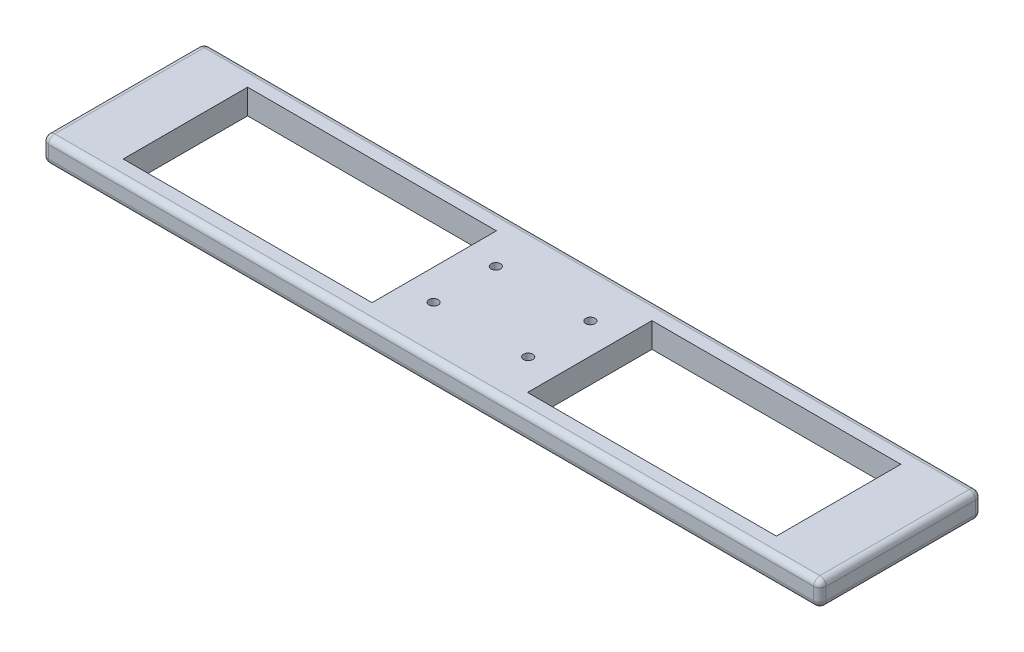
ISO-10303-21;
HEADER;
FILE_DESCRIPTION(('STEP AP214'),'2;1');
FILE_NAME('part.step','',(''),(''),'','','');
FILE_SCHEMA(('AUTOMOTIVE_DESIGN { 1 0 10303 214 1 1 1 1 }'));
ENDSEC;
DATA;
#1=APPLICATION_CONTEXT('core data for automotive mechanical design processes');
#2=APPLICATION_PROTOCOL_DEFINITION('international standard','automotive_design',2000,#1);
#3=PRODUCT_CONTEXT('',#1,'mechanical');
#4=PRODUCT('Part','Part','',(#3));
#5=PRODUCT_RELATED_PRODUCT_CATEGORY('part','',(#4));
#6=PRODUCT_DEFINITION_FORMATION('','',#4);
#7=PRODUCT_DEFINITION_CONTEXT('part definition',#1,'design');
#8=PRODUCT_DEFINITION('design','',#6,#7);
#9=PRODUCT_DEFINITION_SHAPE('','',#8);
#10=(LENGTH_UNIT() NAMED_UNIT(*) SI_UNIT(.MILLI.,.METRE.));
#11=(NAMED_UNIT(*) PLANE_ANGLE_UNIT() SI_UNIT($,.RADIAN.));
#12=(NAMED_UNIT(*) SI_UNIT($,.STERADIAN.) SOLID_ANGLE_UNIT());
#13=UNCERTAINTY_MEASURE_WITH_UNIT(LENGTH_MEASURE(1.E-05),#10,'distance_accuracy_value','');
#14=(GEOMETRIC_REPRESENTATION_CONTEXT(3) GLOBAL_UNCERTAINTY_ASSIGNED_CONTEXT((#13)) GLOBAL_UNIT_ASSIGNED_CONTEXT((#10,
#11,#12)) REPRESENTATION_CONTEXT('',''));
#15=CARTESIAN_POINT('',(0.,0.,0.));
#16=DIRECTION('',(0.,0.,1.));
#17=DIRECTION('',(1.,0.,0.));
#18=AXIS2_PLACEMENT_3D('',#15,#16,#17);
#19=CARTESIAN_POINT('',(0.,4.,0.));
#20=DIRECTION('',(0.,-1.,0.));
#21=DIRECTION('',(0.,0.,-1.));
#22=AXIS2_PLACEMENT_3D('',#19,#20,#21);
#23=PLANE('',#22);
#24=CARTESIAN_POINT('',(54.9,4.,-18.));
#25=DIRECTION('',(0.,1.,0.));
#26=DIRECTION('',(0.,0.,1.));
#27=AXIS2_PLACEMENT_3D('',#24,#25,#26);
#28=CIRCLE('',#27,0.749999999999987);
#29=CARTESIAN_POINT('',(54.9,4.,-17.25));
#30=VERTEX_POINT('',#29);
#31=EDGE_CURVE('E467',#30,#30,#28,.T.);
#32=ORIENTED_EDGE('',*,*,#31,.F.);
#33=EDGE_LOOP('',(#32));
#34=FACE_BOUND('',#33,.T.);
#35=CARTESIAN_POINT('',(70.1,4.,-18.));
#36=DIRECTION('',(0.,1.,0.));
#37=DIRECTION('',(0.,0.,1.));
#38=AXIS2_PLACEMENT_3D('',#35,#36,#37);
#39=CIRCLE('',#38,0.749999999999987);
#40=CARTESIAN_POINT('',(70.1,4.,-17.25));
#41=VERTEX_POINT('',#40);
#42=EDGE_CURVE('E461',#41,#41,#39,.T.);
#43=ORIENTED_EDGE('',*,*,#42,.F.);
#44=EDGE_LOOP('',(#43));
#45=FACE_BOUND('',#44,.T.);
#46=CARTESIAN_POINT('',(70.1,4.,-7.99999999999999));
#47=DIRECTION('',(0.,1.,0.));
#48=DIRECTION('',(0.,0.,1.));
#49=AXIS2_PLACEMENT_3D('',#46,#47,#48);
#50=CIRCLE('',#49,0.749999999999987);
#51=CARTESIAN_POINT('',(70.1,4.,-7.25000000000001));
#52=VERTEX_POINT('',#51);
#53=EDGE_CURVE('E448',#52,#52,#50,.T.);
#54=ORIENTED_EDGE('',*,*,#53,.F.);
#55=EDGE_LOOP('',(#54));
#56=FACE_BOUND('',#55,.T.);
#57=CARTESIAN_POINT('',(54.9,4.,-7.99999999999999));
#58=DIRECTION('',(0.,1.,0.));
#59=DIRECTION('',(0.,0.,1.));
#60=AXIS2_PLACEMENT_3D('',#57,#58,#59);
#61=CIRCLE('',#60,0.749999999999987);
#62=CARTESIAN_POINT('',(54.9,4.,-7.25000000000001));
#63=VERTEX_POINT('',#62);
#64=EDGE_CURVE('E447',#63,#63,#61,.T.);
#65=ORIENTED_EDGE('',*,*,#64,.F.);
#66=EDGE_LOOP('',(#65));
#67=FACE_BOUND('',#66,.T.);
#68=DIRECTION('',(1.,0.,0.));
#69=VECTOR('',#68,1.);
#70=CARTESIAN_POINT('',(0.,4.,-1.));
#71=LINE('',#70,#69);
#72=CARTESIAN_POINT('',(1.,4.,-1.));
#73=VERTEX_POINT('',#72);
#74=CARTESIAN_POINT('',(124.,4.,-1.));
#75=VERTEX_POINT('',#74);
#76=EDGE_CURVE('E289',#73,#75,#71,.T.);
#77=ORIENTED_EDGE('',*,*,#76,.T.);
#78=DIRECTION('',(0.,0.,-1.));
#79=VECTOR('',#78,1.);
#80=CARTESIAN_POINT('',(124.,4.,0.));
#81=LINE('',#80,#79);
#82=CARTESIAN_POINT('',(124.,4.,-25.));
#83=VERTEX_POINT('',#82);
#84=EDGE_CURVE('E295',#75,#83,#81,.T.);
#85=ORIENTED_EDGE('',*,*,#84,.T.);
#86=DIRECTION('',(-1.,0.,0.));
#87=VECTOR('',#86,1.);
#88=CARTESIAN_POINT('',(0.,4.,-25.));
#89=LINE('',#88,#87);
#90=CARTESIAN_POINT('',(1.,4.,-25.));
#91=VERTEX_POINT('',#90);
#92=EDGE_CURVE('E292',#83,#91,#89,.T.);
#93=ORIENTED_EDGE('',*,*,#92,.T.);
#94=DIRECTION('',(0.,0.,1.));
#95=VECTOR('',#94,1.);
#96=CARTESIAN_POINT('',(1.,4.,0.));
#97=LINE('',#96,#95);
#98=EDGE_CURVE('E238',#91,#73,#97,.T.);
#99=ORIENTED_EDGE('',*,*,#98,.T.);
#100=EDGE_LOOP('',(#77,#85,#93,#99));
#101=FACE_BOUND('',#100,.T.);
#102=DIRECTION('',(1.,0.,0.));
#103=VECTOR('',#102,1.);
#104=CARTESIAN_POINT('',(0.,4.,-3.));
#105=LINE('',#104,#103);
#106=CARTESIAN_POINT('',(10.,4.,-3.));
#107=VERTEX_POINT('',#106);
#108=CARTESIAN_POINT('',(50.,4.,-3.));
#109=VERTEX_POINT('',#108);
#110=EDGE_CURVE('E228',#107,#109,#105,.T.);
#111=ORIENTED_EDGE('',*,*,#110,.F.);
#112=DIRECTION('',(0.,0.,1.));
#113=VECTOR('',#112,1.);
#114=CARTESIAN_POINT('',(10.,4.,0.));
#115=LINE('',#114,#113);
#116=CARTESIAN_POINT('',(9.99999999999999,4.,-23.));
#117=VERTEX_POINT('',#116);
#118=EDGE_CURVE('E192',#117,#107,#115,.T.);
#119=ORIENTED_EDGE('',*,*,#118,.F.);
#120=DIRECTION('',(1.,0.,0.));
#121=VECTOR('',#120,1.);
#122=CARTESIAN_POINT('',(0.,4.,-23.));
#123=LINE('',#122,#121);
#124=CARTESIAN_POINT('',(50.,4.,-23.));
#125=VERTEX_POINT('',#124);
#126=EDGE_CURVE('E212',#117,#125,#123,.T.);
#127=ORIENTED_EDGE('',*,*,#126,.T.);
#128=DIRECTION('',(0.,0.,1.));
#129=VECTOR('',#128,1.);
#130=CARTESIAN_POINT('',(50.,4.,0.));
#131=LINE('',#130,#129);
#132=EDGE_CURVE('E216',#125,#109,#131,.T.);
#133=ORIENTED_EDGE('',*,*,#132,.T.);
#134=EDGE_LOOP('',(#111,#119,#127,#133));
#135=FACE_BOUND('',#134,.T.);
#136=DIRECTION('',(0.,0.,1.));
#137=VECTOR('',#136,1.);
#138=CARTESIAN_POINT('',(115.,4.,0.));
#139=LINE('',#138,#137);
#140=CARTESIAN_POINT('',(115.,4.,-23.));
#141=VERTEX_POINT('',#140);
#142=CARTESIAN_POINT('',(115.,4.,-3.));
#143=VERTEX_POINT('',#142);
#144=EDGE_CURVE('E260',#141,#143,#139,.T.);
#145=ORIENTED_EDGE('',*,*,#144,.T.);
#146=DIRECTION('',(1.,0.,0.));
#147=VECTOR('',#146,1.);
#148=CARTESIAN_POINT('',(0.,4.,-3.));
#149=LINE('',#148,#147);
#150=CARTESIAN_POINT('',(75.,4.,-3.));
#151=VERTEX_POINT('',#150);
#152=EDGE_CURVE('E248',#151,#143,#149,.T.);
#153=ORIENTED_EDGE('',*,*,#152,.F.);
#154=DIRECTION('',(0.,0.,1.));
#155=VECTOR('',#154,1.);
#156=CARTESIAN_POINT('',(75.,4.,0.));
#157=LINE('',#156,#155);
#158=CARTESIAN_POINT('',(75.,4.,-23.));
#159=VERTEX_POINT('',#158);
#160=EDGE_CURVE('E269',#159,#151,#157,.T.);
#161=ORIENTED_EDGE('',*,*,#160,.F.);
#162=DIRECTION('',(1.,0.,0.));
#163=VECTOR('',#162,1.);
#164=CARTESIAN_POINT('',(0.,4.,-23.));
#165=LINE('',#164,#163);
#166=EDGE_CURVE('E264',#159,#141,#165,.T.);
#167=ORIENTED_EDGE('',*,*,#166,.T.);
#168=EDGE_LOOP('',(#145,#153,#161,#167));
#169=FACE_BOUND('',#168,.T.);
#170=ADVANCED_FACE('F44',(#34,#45,#56,#67,#101,#135,#169),#23,.F.);
#171=CARTESIAN_POINT('',(0.,0.,0.));
#172=DIRECTION('',(0.,-1.,0.));
#173=DIRECTION('',(0.,0.,-1.));
#174=AXIS2_PLACEMENT_3D('',#171,#172,#173);
#175=PLANE('',#174);
#176=CARTESIAN_POINT('',(54.9,0.,-18.));
#177=DIRECTION('',(0.,-1.,0.));
#178=DIRECTION('',(0.,0.,-1.));
#179=AXIS2_PLACEMENT_3D('',#176,#177,#178);
#180=CIRCLE('',#179,0.749999999999987);
#181=CARTESIAN_POINT('',(54.9,0.,-18.75));
#182=VERTEX_POINT('',#181);
#183=EDGE_CURVE('E48',#182,#182,#180,.T.);
#184=ORIENTED_EDGE('',*,*,#183,.F.);
#185=EDGE_LOOP('',(#184));
#186=FACE_BOUND('',#185,.T.);
#187=CARTESIAN_POINT('',(70.1,0.,-18.));
#188=DIRECTION('',(0.,-1.,0.));
#189=DIRECTION('',(0.,0.,-1.));
#190=AXIS2_PLACEMENT_3D('',#187,#188,#189);
#191=CIRCLE('',#190,0.749999999999987);
#192=CARTESIAN_POINT('',(70.1,0.,-18.75));
#193=VERTEX_POINT('',#192);
#194=EDGE_CURVE('E455',#193,#193,#191,.T.);
#195=ORIENTED_EDGE('',*,*,#194,.F.);
#196=EDGE_LOOP('',(#195));
#197=FACE_BOUND('',#196,.T.);
#198=CARTESIAN_POINT('',(70.1,0.,-7.99999999999999));
#199=DIRECTION('',(0.,-1.,0.));
#200=DIRECTION('',(0.,0.,-1.));
#201=AXIS2_PLACEMENT_3D('',#198,#199,#200);
#202=CIRCLE('',#201,0.749999999999987);
#203=CARTESIAN_POINT('',(70.1,0.,-8.74999999999998));
#204=VERTEX_POINT('',#203);
#205=EDGE_CURVE('E444',#204,#204,#202,.T.);
#206=ORIENTED_EDGE('',*,*,#205,.F.);
#207=EDGE_LOOP('',(#206));
#208=FACE_BOUND('',#207,.T.);
#209=CARTESIAN_POINT('',(54.9,0.,-7.99999999999999));
#210=DIRECTION('',(0.,-1.,0.));
#211=DIRECTION('',(0.,0.,-1.));
#212=AXIS2_PLACEMENT_3D('',#209,#210,#211);
#213=CIRCLE('',#212,0.749999999999987);
#214=CARTESIAN_POINT('',(54.9,0.,-8.74999999999998));
#215=VERTEX_POINT('',#214);
#216=EDGE_CURVE('E219',#215,#215,#213,.T.);
#217=ORIENTED_EDGE('',*,*,#216,.F.);
#218=EDGE_LOOP('',(#217));
#219=FACE_BOUND('',#218,.T.);
#220=DIRECTION('',(-1.,0.,0.));
#221=VECTOR('',#220,1.);
#222=CARTESIAN_POINT('',(125.,0.,-25.));
#223=LINE('',#222,#221);
#224=CARTESIAN_POINT('',(1.,0.,-25.));
#225=VERTEX_POINT('',#224);
#226=CARTESIAN_POINT('',(124.,0.,-25.));
#227=VERTEX_POINT('',#226);
#228=EDGE_CURVE('E344',#225,#227,#223,.F.);
#229=ORIENTED_EDGE('',*,*,#228,.T.);
#230=DIRECTION('',(0.,0.,-1.));
#231=VECTOR('',#230,1.);
#232=CARTESIAN_POINT('',(124.,0.,0.));
#233=LINE('',#232,#231);
#234=CARTESIAN_POINT('',(124.,0.,-1.));
#235=VERTEX_POINT('',#234);
#236=EDGE_CURVE('E347',#227,#235,#233,.F.);
#237=ORIENTED_EDGE('',*,*,#236,.T.);
#238=DIRECTION('',(1.,0.,0.));
#239=VECTOR('',#238,1.);
#240=CARTESIAN_POINT('',(0.,0.,-1.));
#241=LINE('',#240,#239);
#242=CARTESIAN_POINT('',(1.,0.,-1.));
#243=VERTEX_POINT('',#242);
#244=EDGE_CURVE('E338',#235,#243,#241,.F.);
#245=ORIENTED_EDGE('',*,*,#244,.T.);
#246=DIRECTION('',(0.,0.,1.));
#247=VECTOR('',#246,1.);
#248=CARTESIAN_POINT('',(1.,0.,-26.));
#249=LINE('',#248,#247);
#250=EDGE_CURVE('E341',#243,#225,#249,.F.);
#251=ORIENTED_EDGE('',*,*,#250,.T.);
#252=EDGE_LOOP('',(#229,#237,#245,#251));
#253=FACE_BOUND('',#252,.T.);
#254=DIRECTION('',(0.,0.,1.));
#255=VECTOR('',#254,1.);
#256=CARTESIAN_POINT('',(10.,0.,0.));
#257=LINE('',#256,#255);
#258=CARTESIAN_POINT('',(9.99999999999999,0.,-23.));
#259=VERTEX_POINT('',#258);
#260=CARTESIAN_POINT('',(10.,0.,-3.));
#261=VERTEX_POINT('',#260);
#262=EDGE_CURVE('E189',#259,#261,#257,.T.);
#263=ORIENTED_EDGE('',*,*,#262,.T.);
#264=DIRECTION('',(1.,0.,0.));
#265=VECTOR('',#264,1.);
#266=CARTESIAN_POINT('',(0.,0.,-3.));
#267=LINE('',#266,#265);
#268=CARTESIAN_POINT('',(50.,0.,-3.));
#269=VERTEX_POINT('',#268);
#270=EDGE_CURVE('E201',#261,#269,#267,.T.);
#271=ORIENTED_EDGE('',*,*,#270,.T.);
#272=DIRECTION('',(0.,0.,1.));
#273=VECTOR('',#272,1.);
#274=CARTESIAN_POINT('',(50.,0.,0.));
#275=LINE('',#274,#273);
#276=CARTESIAN_POINT('',(50.,0.,-23.));
#277=VERTEX_POINT('',#276);
#278=EDGE_CURVE('E207',#277,#269,#275,.T.);
#279=ORIENTED_EDGE('',*,*,#278,.F.);
#280=DIRECTION('',(1.,0.,0.));
#281=VECTOR('',#280,1.);
#282=CARTESIAN_POINT('',(0.,0.,-23.));
#283=LINE('',#282,#281);
#284=EDGE_CURVE('E198',#259,#277,#283,.T.);
#285=ORIENTED_EDGE('',*,*,#284,.F.);
#286=EDGE_LOOP('',(#263,#271,#279,#285));
#287=FACE_BOUND('',#286,.T.);
#288=DIRECTION('',(1.,0.,0.));
#289=VECTOR('',#288,1.);
#290=CARTESIAN_POINT('',(0.,0.,-3.));
#291=LINE('',#290,#289);
#292=CARTESIAN_POINT('',(75.,0.,-3.));
#293=VERTEX_POINT('',#292);
#294=CARTESIAN_POINT('',(115.,0.,-3.));
#295=VERTEX_POINT('',#294);
#296=EDGE_CURVE('E255',#293,#295,#291,.T.);
#297=ORIENTED_EDGE('',*,*,#296,.T.);
#298=DIRECTION('',(0.,0.,1.));
#299=VECTOR('',#298,1.);
#300=CARTESIAN_POINT('',(115.,0.,0.));
#301=LINE('',#300,#299);
#302=CARTESIAN_POINT('',(115.,0.,-23.));
#303=VERTEX_POINT('',#302);
#304=EDGE_CURVE('E244',#303,#295,#301,.T.);
#305=ORIENTED_EDGE('',*,*,#304,.F.);
#306=DIRECTION('',(1.,0.,0.));
#307=VECTOR('',#306,1.);
#308=CARTESIAN_POINT('',(0.,0.,-23.));
#309=LINE('',#308,#307);
#310=CARTESIAN_POINT('',(75.,0.,-23.));
#311=VERTEX_POINT('',#310);
#312=EDGE_CURVE('E247',#311,#303,#309,.T.);
#313=ORIENTED_EDGE('',*,*,#312,.F.);
#314=DIRECTION('',(0.,0.,1.));
#315=VECTOR('',#314,1.);
#316=CARTESIAN_POINT('',(75.,0.,0.));
#317=LINE('',#316,#315);
#318=EDGE_CURVE('E251',#311,#293,#317,.T.);
#319=ORIENTED_EDGE('',*,*,#318,.T.);
#320=EDGE_LOOP('',(#297,#305,#313,#319));
#321=FACE_BOUND('',#320,.T.);
#322=ADVANCED_FACE('F209',(#186,#197,#208,#219,#253,#287,#321),#175,.T.);
#323=CARTESIAN_POINT('',(0.,4.,0.));
#324=DIRECTION('',(1.,0.,0.));
#325=DIRECTION('',(0.,0.,-1.));
#326=AXIS2_PLACEMENT_3D('',#323,#324,#325);
#327=PLANE('',#326);
#328=DIRECTION('',(0.,0.,1.));
#329=VECTOR('',#328,1.);
#330=CARTESIAN_POINT('',(0.,3.,0.));
#331=LINE('',#330,#329);
#332=CARTESIAN_POINT('',(0.,3.,-1.));
#333=VERTEX_POINT('',#332);
#334=CARTESIAN_POINT('',(0.,3.,-25.));
#335=VERTEX_POINT('',#334);
#336=EDGE_CURVE('E69',#333,#335,#331,.F.);
#337=ORIENTED_EDGE('',*,*,#336,.T.);
#338=DIRECTION('',(0.,-1.,0.));
#339=VECTOR('',#338,1.);
#340=CARTESIAN_POINT('',(0.,4.,-25.));
#341=LINE('',#340,#339);
#342=CARTESIAN_POINT('',(0.,1.,-25.));
#343=VERTEX_POINT('',#342);
#344=EDGE_CURVE('E11',#335,#343,#341,.T.);
#345=ORIENTED_EDGE('',*,*,#344,.T.);
#346=DIRECTION('',(0.,0.,1.));
#347=VECTOR('',#346,1.);
#348=CARTESIAN_POINT('',(0.,1.,0.));
#349=LINE('',#348,#347);
#350=CARTESIAN_POINT('',(0.,1.,-1.));
#351=VERTEX_POINT('',#350);
#352=EDGE_CURVE('E54',#343,#351,#349,.T.);
#353=ORIENTED_EDGE('',*,*,#352,.T.);
#354=DIRECTION('',(0.,-1.,0.));
#355=VECTOR('',#354,1.);
#356=CARTESIAN_POINT('',(0.,4.,-1.));
#357=LINE('',#356,#355);
#358=EDGE_CURVE('E351',#351,#333,#357,.F.);
#359=ORIENTED_EDGE('',*,*,#358,.T.);
#360=EDGE_LOOP('',(#337,#345,#353,#359));
#361=FACE_BOUND('',#360,.T.);
#362=ADVANCED_FACE('F480',(#361),#327,.F.);
#363=CARTESIAN_POINT('',(0.,4.,0.));
#364=DIRECTION('',(0.,0.,-1.));
#365=DIRECTION('',(-1.,0.,0.));
#366=AXIS2_PLACEMENT_3D('',#363,#364,#365);
#367=PLANE('',#366);
#368=DIRECTION('',(1.,0.,0.));
#369=VECTOR('',#368,1.);
#370=CARTESIAN_POINT('',(125.,1.,0.));
#371=LINE('',#370,#369);
#372=CARTESIAN_POINT('',(1.,1.,0.));
#373=VERTEX_POINT('',#372);
#374=CARTESIAN_POINT('',(124.,1.,0.));
#375=VERTEX_POINT('',#374);
#376=EDGE_CURVE('E318',#373,#375,#371,.T.);
#377=ORIENTED_EDGE('',*,*,#376,.T.);
#378=DIRECTION('',(0.,-1.,0.));
#379=VECTOR('',#378,1.);
#380=CARTESIAN_POINT('',(124.,4.,0.));
#381=LINE('',#380,#379);
#382=CARTESIAN_POINT('',(124.,3.,0.));
#383=VERTEX_POINT('',#382);
#384=EDGE_CURVE('E321',#375,#383,#381,.F.);
#385=ORIENTED_EDGE('',*,*,#384,.T.);
#386=DIRECTION('',(1.,0.,0.));
#387=VECTOR('',#386,1.);
#388=CARTESIAN_POINT('',(0.,3.,0.));
#389=LINE('',#388,#387);
#390=CARTESIAN_POINT('',(1.,3.,0.));
#391=VERTEX_POINT('',#390);
#392=EDGE_CURVE('E315',#383,#391,#389,.F.);
#393=ORIENTED_EDGE('',*,*,#392,.T.);
#394=DIRECTION('',(0.,-1.,0.));
#395=VECTOR('',#394,1.);
#396=CARTESIAN_POINT('',(1.,4.,0.));
#397=LINE('',#396,#395);
#398=EDGE_CURVE('E312',#391,#373,#397,.T.);
#399=ORIENTED_EDGE('',*,*,#398,.T.);
#400=EDGE_LOOP('',(#377,#385,#393,#399));
#401=FACE_BOUND('',#400,.T.);
#402=ADVANCED_FACE('F524',(#401),#367,.F.);
#403=CARTESIAN_POINT('',(125.,4.,0.));
#404=DIRECTION('',(-1.,0.,0.));
#405=DIRECTION('',(0.,0.,1.));
#406=AXIS2_PLACEMENT_3D('',#403,#404,#405);
#407=PLANE('',#406);
#408=DIRECTION('',(0.,-1.,0.));
#409=VECTOR('',#408,1.);
#410=CARTESIAN_POINT('',(125.,4.,-25.));
#411=LINE('',#410,#409);
#412=CARTESIAN_POINT('',(125.,1.,-25.));
#413=VERTEX_POINT('',#412);
#414=CARTESIAN_POINT('',(125.,3.,-25.));
#415=VERTEX_POINT('',#414);
#416=EDGE_CURVE('E302',#413,#415,#411,.F.);
#417=ORIENTED_EDGE('',*,*,#416,.T.);
#418=DIRECTION('',(0.,0.,-1.));
#419=VECTOR('',#418,1.);
#420=CARTESIAN_POINT('',(125.,3.,0.));
#421=LINE('',#420,#419);
#422=CARTESIAN_POINT('',(125.,3.,-1.));
#423=VERTEX_POINT('',#422);
#424=EDGE_CURVE('E308',#415,#423,#421,.F.);
#425=ORIENTED_EDGE('',*,*,#424,.T.);
#426=DIRECTION('',(0.,-1.,0.));
#427=VECTOR('',#426,1.);
#428=CARTESIAN_POINT('',(125.,4.,-1.));
#429=LINE('',#428,#427);
#430=CARTESIAN_POINT('',(125.,1.,-1.));
#431=VERTEX_POINT('',#430);
#432=EDGE_CURVE('E305',#423,#431,#429,.T.);
#433=ORIENTED_EDGE('',*,*,#432,.T.);
#434=DIRECTION('',(0.,0.,-1.));
#435=VECTOR('',#434,1.);
#436=CARTESIAN_POINT('',(125.,1.,-26.));
#437=LINE('',#436,#435);
#438=EDGE_CURVE('E299',#431,#413,#437,.T.);
#439=ORIENTED_EDGE('',*,*,#438,.T.);
#440=EDGE_LOOP('',(#417,#425,#433,#439));
#441=FACE_BOUND('',#440,.T.);
#442=ADVANCED_FACE('F512',(#441),#407,.F.);
#443=CARTESIAN_POINT('',(0.,4.,-26.));
#444=DIRECTION('',(0.,0.,1.));
#445=DIRECTION('',(1.,0.,0.));
#446=AXIS2_PLACEMENT_3D('',#443,#444,#445);
#447=PLANE('',#446);
#448=DIRECTION('',(-1.,0.,0.));
#449=VECTOR('',#448,1.);
#450=CARTESIAN_POINT('',(0.,3.,-26.));
#451=LINE('',#450,#449);
#452=CARTESIAN_POINT('',(1.,3.,-26.));
#453=VERTEX_POINT('',#452);
#454=CARTESIAN_POINT('',(124.,3.,-26.));
#455=VERTEX_POINT('',#454);
#456=EDGE_CURVE('E325',#453,#455,#451,.F.);
#457=ORIENTED_EDGE('',*,*,#456,.T.);
#458=DIRECTION('',(0.,-1.,0.));
#459=VECTOR('',#458,1.);
#460=CARTESIAN_POINT('',(124.,4.,-26.));
#461=LINE('',#460,#459);
#462=CARTESIAN_POINT('',(124.,1.,-26.));
#463=VERTEX_POINT('',#462);
#464=EDGE_CURVE('E334',#455,#463,#461,.T.);
#465=ORIENTED_EDGE('',*,*,#464,.T.);
#466=DIRECTION('',(-1.,0.,0.));
#467=VECTOR('',#466,1.);
#468=CARTESIAN_POINT('',(0.,1.,-26.));
#469=LINE('',#468,#467);
#470=CARTESIAN_POINT('',(1.,1.,-26.));
#471=VERTEX_POINT('',#470);
#472=EDGE_CURVE('E331',#463,#471,#469,.T.);
#473=ORIENTED_EDGE('',*,*,#472,.T.);
#474=DIRECTION('',(0.,-1.,0.));
#475=VECTOR('',#474,1.);
#476=CARTESIAN_POINT('',(1.,4.,-26.));
#477=LINE('',#476,#475);
#478=EDGE_CURVE('E328',#471,#453,#477,.F.);
#479=ORIENTED_EDGE('',*,*,#478,.T.);
#480=EDGE_LOOP('',(#457,#465,#473,#479));
#481=FACE_BOUND('',#480,.T.);
#482=ADVANCED_FACE('F554',(#481),#447,.F.);
#483=CARTESIAN_POINT('',(115.,0.,0.));
#484=DIRECTION('',(-1.,0.,0.));
#485=DIRECTION('',(0.,0.,1.));
#486=AXIS2_PLACEMENT_3D('',#483,#484,#485);
#487=PLANE('',#486);
#488=ORIENTED_EDGE('',*,*,#144,.F.);
#489=DIRECTION('',(0.,1.,0.));
#490=VECTOR('',#489,1.);
#491=CARTESIAN_POINT('',(115.,0.,-23.));
#492=LINE('',#491,#490);
#493=EDGE_CURVE('E259',#303,#141,#492,.T.);
#494=ORIENTED_EDGE('',*,*,#493,.F.);
#495=ORIENTED_EDGE('',*,*,#304,.T.);
#496=DIRECTION('',(0.,1.,0.));
#497=VECTOR('',#496,1.);
#498=CARTESIAN_POINT('',(115.,0.,-3.));
#499=LINE('',#498,#497);
#500=EDGE_CURVE('E229',#295,#143,#499,.T.);
#501=ORIENTED_EDGE('',*,*,#500,.T.);
#502=EDGE_LOOP('',(#488,#494,#495,#501));
#503=FACE_BOUND('',#502,.T.);
#504=ADVANCED_FACE('F572',(#503),#487,.T.);
#505=CARTESIAN_POINT('',(0.,0.,-3.));
#506=DIRECTION('',(0.,0.,1.));
#507=DIRECTION('',(1.,0.,0.));
#508=AXIS2_PLACEMENT_3D('',#505,#506,#507);
#509=PLANE('',#508);
#510=ORIENTED_EDGE('',*,*,#152,.T.);
#511=ORIENTED_EDGE('',*,*,#500,.F.);
#512=ORIENTED_EDGE('',*,*,#296,.F.);
#513=DIRECTION('',(0.,1.,0.));
#514=VECTOR('',#513,1.);
#515=CARTESIAN_POINT('',(75.,0.,-3.));
#516=LINE('',#515,#514);
#517=EDGE_CURVE('E278',#293,#151,#516,.T.);
#518=ORIENTED_EDGE('',*,*,#517,.T.);
#519=EDGE_LOOP('',(#510,#511,#512,#518));
#520=FACE_BOUND('',#519,.T.);
#521=ADVANCED_FACE('F759',(#520),#509,.F.);
#522=CARTESIAN_POINT('',(75.,0.,0.));
#523=DIRECTION('',(-1.,0.,0.));
#524=DIRECTION('',(0.,0.,1.));
#525=AXIS2_PLACEMENT_3D('',#522,#523,#524);
#526=PLANE('',#525);
#527=ORIENTED_EDGE('',*,*,#160,.T.);
#528=ORIENTED_EDGE('',*,*,#517,.F.);
#529=ORIENTED_EDGE('',*,*,#318,.F.);
#530=DIRECTION('',(0.,1.,0.));
#531=VECTOR('',#530,1.);
#532=CARTESIAN_POINT('',(75.,0.,-23.));
#533=LINE('',#532,#531);
#534=EDGE_CURVE('E281',#311,#159,#533,.T.);
#535=ORIENTED_EDGE('',*,*,#534,.T.);
#536=EDGE_LOOP('',(#527,#528,#529,#535));
#537=FACE_BOUND('',#536,.T.);
#538=ADVANCED_FACE('F762',(#537),#526,.F.);
#539=CARTESIAN_POINT('',(0.,0.,-23.));
#540=DIRECTION('',(0.,0.,1.));
#541=DIRECTION('',(1.,0.,0.));
#542=AXIS2_PLACEMENT_3D('',#539,#540,#541);
#543=PLANE('',#542);
#544=ORIENTED_EDGE('',*,*,#166,.F.);
#545=ORIENTED_EDGE('',*,*,#534,.F.);
#546=ORIENTED_EDGE('',*,*,#312,.T.);
#547=ORIENTED_EDGE('',*,*,#493,.T.);
#548=EDGE_LOOP('',(#544,#545,#546,#547));
#549=FACE_BOUND('',#548,.T.);
#550=ADVANCED_FACE('F758',(#549),#543,.T.);
#551=CARTESIAN_POINT('',(10.,0.,0.));
#552=DIRECTION('',(-1.,0.,0.));
#553=DIRECTION('',(0.,0.,1.));
#554=AXIS2_PLACEMENT_3D('',#551,#552,#553);
#555=PLANE('',#554);
#556=ORIENTED_EDGE('',*,*,#118,.T.);
#557=DIRECTION('',(0.,1.,0.));
#558=VECTOR('',#557,1.);
#559=CARTESIAN_POINT('',(10.,0.,-3.));
#560=LINE('',#559,#558);
#561=EDGE_CURVE('E185',#261,#107,#560,.T.);
#562=ORIENTED_EDGE('',*,*,#561,.F.);
#563=ORIENTED_EDGE('',*,*,#262,.F.);
#564=DIRECTION('',(0.,1.,0.));
#565=VECTOR('',#564,1.);
#566=CARTESIAN_POINT('',(9.99999999999999,0.,-23.));
#567=LINE('',#566,#565);
#568=EDGE_CURVE('E235',#259,#117,#567,.T.);
#569=ORIENTED_EDGE('',*,*,#568,.T.);
#570=EDGE_LOOP('',(#556,#562,#563,#569));
#571=FACE_BOUND('',#570,.T.);
#572=ADVANCED_FACE('F187',(#571),#555,.F.);
#573=CARTESIAN_POINT('',(0.,0.,-23.));
#574=DIRECTION('',(0.,0.,1.));
#575=DIRECTION('',(1.,0.,0.));
#576=AXIS2_PLACEMENT_3D('',#573,#574,#575);
#577=PLANE('',#576);
#578=ORIENTED_EDGE('',*,*,#126,.F.);
#579=ORIENTED_EDGE('',*,*,#568,.F.);
#580=ORIENTED_EDGE('',*,*,#284,.T.);
#581=DIRECTION('',(0.,1.,0.));
#582=VECTOR('',#581,1.);
#583=CARTESIAN_POINT('',(50.,0.,-23.));
#584=LINE('',#583,#582);
#585=EDGE_CURVE('E239',#277,#125,#584,.T.);
#586=ORIENTED_EDGE('',*,*,#585,.T.);
#587=EDGE_LOOP('',(#578,#579,#580,#586));
#588=FACE_BOUND('',#587,.T.);
#589=ADVANCED_FACE('F746',(#588),#577,.T.);
#590=CARTESIAN_POINT('',(50.,0.,0.));
#591=DIRECTION('',(-1.,0.,0.));
#592=DIRECTION('',(0.,0.,1.));
#593=AXIS2_PLACEMENT_3D('',#590,#591,#592);
#594=PLANE('',#593);
#595=ORIENTED_EDGE('',*,*,#132,.F.);
#596=ORIENTED_EDGE('',*,*,#585,.F.);
#597=ORIENTED_EDGE('',*,*,#278,.T.);
#598=DIRECTION('',(0.,1.,0.));
#599=VECTOR('',#598,1.);
#600=CARTESIAN_POINT('',(50.,0.,-3.));
#601=LINE('',#600,#599);
#602=EDGE_CURVE('E197',#269,#109,#601,.T.);
#603=ORIENTED_EDGE('',*,*,#602,.T.);
#604=EDGE_LOOP('',(#595,#596,#597,#603));
#605=FACE_BOUND('',#604,.T.);
#606=ADVANCED_FACE('F749',(#605),#594,.T.);
#607=CARTESIAN_POINT('',(0.,0.,-3.));
#608=DIRECTION('',(0.,0.,1.));
#609=DIRECTION('',(1.,0.,0.));
#610=AXIS2_PLACEMENT_3D('',#607,#608,#609);
#611=PLANE('',#610);
#612=ORIENTED_EDGE('',*,*,#110,.T.);
#613=ORIENTED_EDGE('',*,*,#602,.F.);
#614=ORIENTED_EDGE('',*,*,#270,.F.);
#615=ORIENTED_EDGE('',*,*,#561,.T.);
#616=EDGE_LOOP('',(#612,#613,#614,#615));
#617=FACE_BOUND('',#616,.T.);
#618=ADVANCED_FACE('F202',(#617),#611,.F.);
#619=CARTESIAN_POINT('',(1.,1.,0.));
#620=DIRECTION('',(0.,0.,-1.));
#621=DIRECTION('',(-1.,0.,0.));
#622=AXIS2_PLACEMENT_3D('',#619,#620,#621);
#623=CYLINDRICAL_SURFACE('',#622,1.);
#624=CARTESIAN_POINT('',(1.,1.,-1.));
#625=DIRECTION('',(0.,0.,1.));
#626=DIRECTION('',(1.,0.,0.));
#627=AXIS2_PLACEMENT_3D('',#624,#625,#626);
#628=CIRCLE('',#627,1.);
#629=EDGE_CURVE('E265',#351,#243,#628,.T.);
#630=ORIENTED_EDGE('',*,*,#629,.F.);
#631=ORIENTED_EDGE('',*,*,#352,.F.);
#632=CARTESIAN_POINT('',(1.,1.,-25.));
#633=DIRECTION('',(0.,0.,-1.));
#634=DIRECTION('',(-1.,0.,0.));
#635=AXIS2_PLACEMENT_3D('',#632,#633,#634);
#636=CIRCLE('',#635,1.);
#637=EDGE_CURVE('E439',#225,#343,#636,.T.);
#638=ORIENTED_EDGE('',*,*,#637,.F.);
#639=ORIENTED_EDGE('',*,*,#250,.F.);
#640=EDGE_LOOP('',(#630,#631,#638,#639));
#641=FACE_BOUND('',#640,.T.);
#642=ADVANCED_FACE('F46',(#641),#623,.T.);
#643=CARTESIAN_POINT('',(1.,1.,-1.));
#644=DIRECTION('',(0.,-1.,0.));
#645=DIRECTION('',(0.,0.,-1.));
#646=AXIS2_PLACEMENT_3D('',#643,#644,#645);
#647=SPHERICAL_SURFACE('',#646,1.);
#648=CARTESIAN_POINT('',(1.,1.,-1.));
#649=DIRECTION('',(0.,-1.,0.));
#650=DIRECTION('',(0.,0.,-1.));
#651=AXIS2_PLACEMENT_3D('',#648,#649,#650);
#652=CIRCLE('',#651,1.);
#653=EDGE_CURVE('E431',#351,#373,#652,.F.);
#654=ORIENTED_EDGE('',*,*,#653,.F.);
#655=ORIENTED_EDGE('',*,*,#629,.T.);
#656=CARTESIAN_POINT('',(1.,1.,-1.));
#657=DIRECTION('',(-1.,0.,0.));
#658=DIRECTION('',(0.,0.,1.));
#659=AXIS2_PLACEMENT_3D('',#656,#657,#658);
#660=CIRCLE('',#659,1.);
#661=EDGE_CURVE('E435',#373,#243,#660,.F.);
#662=ORIENTED_EDGE('',*,*,#661,.F.);
#663=EDGE_LOOP('',(#654,#655,#662));
#664=FACE_BOUND('',#663,.T.);
#665=ADVANCED_FACE('F536',(#664),#647,.T.);
#666=CARTESIAN_POINT('',(1.,1.,-25.));
#667=DIRECTION('',(-1.,0.,0.));
#668=DIRECTION('',(0.,0.,1.));
#669=AXIS2_PLACEMENT_3D('',#666,#667,#668);
#670=SPHERICAL_SURFACE('',#669,1.);
#671=CARTESIAN_POINT('',(1.,1.,-25.));
#672=DIRECTION('',(-1.,0.,0.));
#673=DIRECTION('',(0.,0.,1.));
#674=AXIS2_PLACEMENT_3D('',#671,#672,#673);
#675=CIRCLE('',#674,1.);
#676=EDGE_CURVE('E425',#225,#471,#675,.F.);
#677=ORIENTED_EDGE('',*,*,#676,.F.);
#678=ORIENTED_EDGE('',*,*,#637,.T.);
#679=CARTESIAN_POINT('',(1.,1.,-25.));
#680=DIRECTION('',(0.,-1.,0.));
#681=DIRECTION('',(0.,0.,-1.));
#682=AXIS2_PLACEMENT_3D('',#679,#680,#681);
#683=CIRCLE('',#682,1.);
#684=EDGE_CURVE('E62',#471,#343,#683,.F.);
#685=ORIENTED_EDGE('',*,*,#684,.F.);
#686=EDGE_LOOP('',(#677,#678,#685));
#687=FACE_BOUND('',#686,.T.);
#688=ADVANCED_FACE('F556',(#687),#670,.T.);
#689=CARTESIAN_POINT('',(0.,1.,-1.));
#690=DIRECTION('',(-1.,0.,0.));
#691=DIRECTION('',(0.,0.,1.));
#692=AXIS2_PLACEMENT_3D('',#689,#690,#691);
#693=CYLINDRICAL_SURFACE('',#692,1.);
#694=ORIENTED_EDGE('',*,*,#661,.T.);
#695=ORIENTED_EDGE('',*,*,#244,.F.);
#696=CARTESIAN_POINT('',(124.,1.,-1.));
#697=DIRECTION('',(1.,0.,0.));
#698=DIRECTION('',(0.,0.,-1.));
#699=AXIS2_PLACEMENT_3D('',#696,#697,#698);
#700=CIRCLE('',#699,1.);
#701=EDGE_CURVE('E418',#375,#235,#700,.T.);
#702=ORIENTED_EDGE('',*,*,#701,.F.);
#703=ORIENTED_EDGE('',*,*,#376,.F.);
#704=EDGE_LOOP('',(#694,#695,#702,#703));
#705=FACE_BOUND('',#704,.T.);
#706=ADVANCED_FACE('F528',(#705),#693,.T.);
#707=CARTESIAN_POINT('',(1.,4.,-1.));
#708=DIRECTION('',(0.,-1.,0.));
#709=DIRECTION('',(0.,0.,-1.));
#710=AXIS2_PLACEMENT_3D('',#707,#708,#709);
#711=CYLINDRICAL_SURFACE('',#710,1.);
#712=ORIENTED_EDGE('',*,*,#653,.T.);
#713=ORIENTED_EDGE('',*,*,#398,.F.);
#714=CARTESIAN_POINT('',(1.,3.,-1.));
#715=DIRECTION('',(0.,1.,0.));
#716=DIRECTION('',(0.,0.,1.));
#717=AXIS2_PLACEMENT_3D('',#714,#715,#716);
#718=CIRCLE('',#717,1.);
#719=EDGE_CURVE('E414',#333,#391,#718,.T.);
#720=ORIENTED_EDGE('',*,*,#719,.F.);
#721=ORIENTED_EDGE('',*,*,#358,.F.);
#722=EDGE_LOOP('',(#712,#713,#720,#721));
#723=FACE_BOUND('',#722,.T.);
#724=ADVANCED_FACE('F540',(#723),#711,.T.);
#725=CARTESIAN_POINT('',(1.,3.,0.));
#726=DIRECTION('',(0.,0.,1.));
#727=DIRECTION('',(1.,0.,0.));
#728=AXIS2_PLACEMENT_3D('',#725,#726,#727);
#729=CYLINDRICAL_SURFACE('',#728,1.);
#730=CARTESIAN_POINT('',(1.,3.,-25.));
#731=DIRECTION('',(0.,0.,-1.));
#732=DIRECTION('',(-1.,0.,0.));
#733=AXIS2_PLACEMENT_3D('',#730,#731,#732);
#734=CIRCLE('',#733,1.);
#735=EDGE_CURVE('E406',#335,#91,#734,.T.);
#736=ORIENTED_EDGE('',*,*,#735,.F.);
#737=ORIENTED_EDGE('',*,*,#336,.F.);
#738=CARTESIAN_POINT('',(1.,3.,-1.));
#739=DIRECTION('',(0.,0.,1.));
#740=DIRECTION('',(1.,0.,0.));
#741=AXIS2_PLACEMENT_3D('',#738,#739,#740);
#742=CIRCLE('',#741,1.);
#743=EDGE_CURVE('E410',#73,#333,#742,.T.);
#744=ORIENTED_EDGE('',*,*,#743,.F.);
#745=ORIENTED_EDGE('',*,*,#98,.F.);
#746=EDGE_LOOP('',(#736,#737,#744,#745));
#747=FACE_BOUND('',#746,.T.);
#748=ADVANCED_FACE('F544',(#747),#729,.T.);
#749=CARTESIAN_POINT('',(1.,4.,-25.));
#750=DIRECTION('',(0.,-1.,0.));
#751=DIRECTION('',(0.,0.,-1.));
#752=AXIS2_PLACEMENT_3D('',#749,#750,#751);
#753=CYLINDRICAL_SURFACE('',#752,1.);
#754=ORIENTED_EDGE('',*,*,#684,.T.);
#755=ORIENTED_EDGE('',*,*,#344,.F.);
#756=CARTESIAN_POINT('',(1.,3.,-25.));
#757=DIRECTION('',(0.,1.,0.));
#758=DIRECTION('',(0.,0.,1.));
#759=AXIS2_PLACEMENT_3D('',#756,#757,#758);
#760=CIRCLE('',#759,1.);
#761=EDGE_CURVE('E402',#453,#335,#760,.T.);
#762=ORIENTED_EDGE('',*,*,#761,.F.);
#763=ORIENTED_EDGE('',*,*,#478,.F.);
#764=EDGE_LOOP('',(#754,#755,#762,#763));
#765=FACE_BOUND('',#764,.T.);
#766=ADVANCED_FACE('F552',(#765),#753,.T.);
#767=CARTESIAN_POINT('',(0.,1.,-25.));
#768=DIRECTION('',(1.,0.,0.));
#769=DIRECTION('',(0.,0.,-1.));
#770=AXIS2_PLACEMENT_3D('',#767,#768,#769);
#771=CYLINDRICAL_SURFACE('',#770,1.);
#772=ORIENTED_EDGE('',*,*,#676,.T.);
#773=ORIENTED_EDGE('',*,*,#472,.F.);
#774=CARTESIAN_POINT('',(124.,1.,-25.));
#775=DIRECTION('',(1.,0.,0.));
#776=DIRECTION('',(0.,0.,-1.));
#777=AXIS2_PLACEMENT_3D('',#774,#775,#776);
#778=CIRCLE('',#777,1.);
#779=EDGE_CURVE('E398',#227,#463,#778,.T.);
#780=ORIENTED_EDGE('',*,*,#779,.F.);
#781=ORIENTED_EDGE('',*,*,#228,.F.);
#782=EDGE_LOOP('',(#772,#773,#780,#781));
#783=FACE_BOUND('',#782,.T.);
#784=ADVANCED_FACE('F502',(#783),#771,.T.);
#785=CARTESIAN_POINT('',(124.,1.,0.));
#786=DIRECTION('',(0.,0.,1.));
#787=DIRECTION('',(1.,0.,0.));
#788=AXIS2_PLACEMENT_3D('',#785,#786,#787);
#789=CYLINDRICAL_SURFACE('',#788,1.);
#790=CARTESIAN_POINT('',(124.,1.,-1.));
#791=DIRECTION('',(0.,0.,1.));
#792=DIRECTION('',(1.,0.,0.));
#793=AXIS2_PLACEMENT_3D('',#790,#791,#792);
#794=CIRCLE('',#793,1.);
#795=EDGE_CURVE('E421',#235,#431,#794,.T.);
#796=ORIENTED_EDGE('',*,*,#795,.F.);
#797=ORIENTED_EDGE('',*,*,#236,.F.);
#798=CARTESIAN_POINT('',(124.,1.,-25.));
#799=DIRECTION('',(0.,0.,-1.));
#800=DIRECTION('',(-1.,0.,0.));
#801=AXIS2_PLACEMENT_3D('',#798,#799,#800);
#802=CIRCLE('',#801,1.);
#803=EDGE_CURVE('E394',#413,#227,#802,.T.);
#804=ORIENTED_EDGE('',*,*,#803,.F.);
#805=ORIENTED_EDGE('',*,*,#438,.F.);
#806=EDGE_LOOP('',(#796,#797,#804,#805));
#807=FACE_BOUND('',#806,.T.);
#808=ADVANCED_FACE('F497',(#807),#789,.T.);
#809=CARTESIAN_POINT('',(124.,1.,-1.));
#810=DIRECTION('',(0.,-1.,0.));
#811=DIRECTION('',(0.,0.,-1.));
#812=AXIS2_PLACEMENT_3D('',#809,#810,#811);
#813=SPHERICAL_SURFACE('',#812,1.);
#814=ORIENTED_EDGE('',*,*,#701,.T.);
#815=ORIENTED_EDGE('',*,*,#795,.T.);
#816=CARTESIAN_POINT('',(124.,1.,-1.));
#817=DIRECTION('',(0.,-1.,0.));
#818=DIRECTION('',(0.,0.,-1.));
#819=AXIS2_PLACEMENT_3D('',#816,#817,#818);
#820=CIRCLE('',#819,1.);
#821=EDGE_CURVE('E390',#375,#431,#820,.F.);
#822=ORIENTED_EDGE('',*,*,#821,.F.);
#823=EDGE_LOOP('',(#814,#815,#822));
#824=FACE_BOUND('',#823,.T.);
#825=ADVANCED_FACE('F516',(#824),#813,.T.);
#826=CARTESIAN_POINT('',(1.,3.,-1.));
#827=DIRECTION('',(-1.,0.,0.));
#828=DIRECTION('',(0.,0.,1.));
#829=AXIS2_PLACEMENT_3D('',#826,#827,#828);
#830=SPHERICAL_SURFACE('',#829,1.);
#831=ORIENTED_EDGE('',*,*,#743,.T.);
#832=ORIENTED_EDGE('',*,*,#719,.T.);
#833=CARTESIAN_POINT('',(1.,3.,-1.));
#834=DIRECTION('',(-1.,0.,0.));
#835=DIRECTION('',(0.,0.,1.));
#836=AXIS2_PLACEMENT_3D('',#833,#834,#835);
#837=CIRCLE('',#836,1.);
#838=EDGE_CURVE('E386',#73,#391,#837,.F.);
#839=ORIENTED_EDGE('',*,*,#838,.F.);
#840=EDGE_LOOP('',(#831,#832,#839));
#841=FACE_BOUND('',#840,.T.);
#842=ADVANCED_FACE('F611',(#841),#830,.T.);
#843=CARTESIAN_POINT('',(1.,3.,-25.));
#844=DIRECTION('',(-1.,0.,0.));
#845=DIRECTION('',(0.,0.,1.));
#846=AXIS2_PLACEMENT_3D('',#843,#844,#845);
#847=SPHERICAL_SURFACE('',#846,1.);
#848=ORIENTED_EDGE('',*,*,#761,.T.);
#849=ORIENTED_EDGE('',*,*,#735,.T.);
#850=CARTESIAN_POINT('',(1.,3.,-25.));
#851=DIRECTION('',(-1.,0.,0.));
#852=DIRECTION('',(0.,0.,1.));
#853=AXIS2_PLACEMENT_3D('',#850,#851,#852);
#854=CIRCLE('',#853,1.);
#855=EDGE_CURVE('E382',#453,#91,#854,.F.);
#856=ORIENTED_EDGE('',*,*,#855,.F.);
#857=EDGE_LOOP('',(#848,#849,#856));
#858=FACE_BOUND('',#857,.T.);
#859=ADVANCED_FACE('F550',(#858),#847,.T.);
#860=CARTESIAN_POINT('',(124.,1.,-25.));
#861=DIRECTION('',(0.,-1.,0.));
#862=DIRECTION('',(0.,0.,-1.));
#863=AXIS2_PLACEMENT_3D('',#860,#861,#862);
#864=SPHERICAL_SURFACE('',#863,1.);
#865=ORIENTED_EDGE('',*,*,#803,.T.);
#866=ORIENTED_EDGE('',*,*,#779,.T.);
#867=CARTESIAN_POINT('',(124.,1.,-25.));
#868=DIRECTION('',(0.,-1.,0.));
#869=DIRECTION('',(0.,0.,-1.));
#870=AXIS2_PLACEMENT_3D('',#867,#868,#869);
#871=CIRCLE('',#870,1.);
#872=EDGE_CURVE('E379',#413,#463,#871,.F.);
#873=ORIENTED_EDGE('',*,*,#872,.F.);
#874=EDGE_LOOP('',(#865,#866,#873));
#875=FACE_BOUND('',#874,.T.);
#876=ADVANCED_FACE('F504',(#875),#864,.T.);
#877=CARTESIAN_POINT('',(124.,4.,-1.));
#878=DIRECTION('',(0.,-1.,0.));
#879=DIRECTION('',(0.,0.,-1.));
#880=AXIS2_PLACEMENT_3D('',#877,#878,#879);
#881=CYLINDRICAL_SURFACE('',#880,1.);
#882=ORIENTED_EDGE('',*,*,#821,.T.);
#883=ORIENTED_EDGE('',*,*,#432,.F.);
#884=CARTESIAN_POINT('',(124.,3.,-1.));
#885=DIRECTION('',(0.,1.,0.));
#886=DIRECTION('',(0.,0.,1.));
#887=AXIS2_PLACEMENT_3D('',#884,#885,#886);
#888=CIRCLE('',#887,1.);
#889=EDGE_CURVE('E375',#383,#423,#888,.T.);
#890=ORIENTED_EDGE('',*,*,#889,.F.);
#891=ORIENTED_EDGE('',*,*,#384,.F.);
#892=EDGE_LOOP('',(#882,#883,#890,#891));
#893=FACE_BOUND('',#892,.T.);
#894=ADVANCED_FACE('F520',(#893),#881,.T.);
#895=CARTESIAN_POINT('',(0.,3.,-1.));
#896=DIRECTION('',(1.,0.,0.));
#897=DIRECTION('',(0.,0.,-1.));
#898=AXIS2_PLACEMENT_3D('',#895,#896,#897);
#899=CYLINDRICAL_SURFACE('',#898,1.);
#900=ORIENTED_EDGE('',*,*,#838,.T.);
#901=ORIENTED_EDGE('',*,*,#392,.F.);
#902=CARTESIAN_POINT('',(124.,3.,-1.));
#903=DIRECTION('',(1.,0.,0.));
#904=DIRECTION('',(0.,0.,-1.));
#905=AXIS2_PLACEMENT_3D('',#902,#903,#904);
#906=CIRCLE('',#905,1.);
#907=EDGE_CURVE('E372',#75,#383,#906,.T.);
#908=ORIENTED_EDGE('',*,*,#907,.F.);
#909=ORIENTED_EDGE('',*,*,#76,.F.);
#910=EDGE_LOOP('',(#900,#901,#908,#909));
#911=FACE_BOUND('',#910,.T.);
#912=ADVANCED_FACE('F600',(#911),#899,.T.);
#913=CARTESIAN_POINT('',(0.,3.,-25.));
#914=DIRECTION('',(-1.,0.,0.));
#915=DIRECTION('',(0.,0.,1.));
#916=AXIS2_PLACEMENT_3D('',#913,#914,#915);
#917=CYLINDRICAL_SURFACE('',#916,1.);
#918=ORIENTED_EDGE('',*,*,#855,.T.);
#919=ORIENTED_EDGE('',*,*,#92,.F.);
#920=CARTESIAN_POINT('',(124.,3.,-25.));
#921=DIRECTION('',(1.,0.,0.));
#922=DIRECTION('',(0.,0.,-1.));
#923=AXIS2_PLACEMENT_3D('',#920,#921,#922);
#924=CIRCLE('',#923,1.);
#925=EDGE_CURVE('E368',#455,#83,#924,.T.);
#926=ORIENTED_EDGE('',*,*,#925,.F.);
#927=ORIENTED_EDGE('',*,*,#456,.F.);
#928=EDGE_LOOP('',(#918,#919,#926,#927));
#929=FACE_BOUND('',#928,.T.);
#930=ADVANCED_FACE('F597',(#929),#917,.T.);
#931=CARTESIAN_POINT('',(124.,4.,-25.));
#932=DIRECTION('',(0.,-1.,0.));
#933=DIRECTION('',(0.,0.,-1.));
#934=AXIS2_PLACEMENT_3D('',#931,#932,#933);
#935=CYLINDRICAL_SURFACE('',#934,1.);
#936=ORIENTED_EDGE('',*,*,#872,.T.);
#937=ORIENTED_EDGE('',*,*,#464,.F.);
#938=CARTESIAN_POINT('',(124.,3.,-25.));
#939=DIRECTION('',(0.,1.,0.));
#940=DIRECTION('',(0.,0.,1.));
#941=AXIS2_PLACEMENT_3D('',#938,#939,#940);
#942=CIRCLE('',#941,1.);
#943=EDGE_CURVE('E364',#415,#455,#942,.T.);
#944=ORIENTED_EDGE('',*,*,#943,.F.);
#945=ORIENTED_EDGE('',*,*,#416,.F.);
#946=EDGE_LOOP('',(#936,#937,#944,#945));
#947=FACE_BOUND('',#946,.T.);
#948=ADVANCED_FACE('F509',(#947),#935,.T.);
#949=CARTESIAN_POINT('',(124.,3.,-1.));
#950=DIRECTION('',(0.,0.,1.));
#951=DIRECTION('',(1.,0.,0.));
#952=AXIS2_PLACEMENT_3D('',#949,#950,#951);
#953=SPHERICAL_SURFACE('',#952,1.);
#954=ORIENTED_EDGE('',*,*,#907,.T.);
#955=ORIENTED_EDGE('',*,*,#889,.T.);
#956=CARTESIAN_POINT('',(124.,3.,-1.));
#957=DIRECTION('',(0.,0.,1.));
#958=DIRECTION('',(1.,0.,0.));
#959=AXIS2_PLACEMENT_3D('',#956,#957,#958);
#960=CIRCLE('',#959,1.);
#961=EDGE_CURVE('E361',#75,#423,#960,.F.);
#962=ORIENTED_EDGE('',*,*,#961,.F.);
#963=EDGE_LOOP('',(#954,#955,#962));
#964=FACE_BOUND('',#963,.T.);
#965=ADVANCED_FACE('F590',(#964),#953,.T.);
#966=CARTESIAN_POINT('',(124.,3.,-25.));
#967=DIRECTION('',(0.,0.,-1.));
#968=DIRECTION('',(-1.,0.,0.));
#969=AXIS2_PLACEMENT_3D('',#966,#967,#968);
#970=SPHERICAL_SURFACE('',#969,1.);
#971=ORIENTED_EDGE('',*,*,#943,.T.);
#972=ORIENTED_EDGE('',*,*,#925,.T.);
#973=CARTESIAN_POINT('',(124.,3.,-25.));
#974=DIRECTION('',(0.,0.,-1.));
#975=DIRECTION('',(-1.,0.,0.));
#976=AXIS2_PLACEMENT_3D('',#973,#974,#975);
#977=CIRCLE('',#976,1.);
#978=EDGE_CURVE('E358',#415,#83,#977,.F.);
#979=ORIENTED_EDGE('',*,*,#978,.F.);
#980=EDGE_LOOP('',(#971,#972,#979));
#981=FACE_BOUND('',#980,.T.);
#982=ADVANCED_FACE('F586',(#981),#970,.T.);
#983=CARTESIAN_POINT('',(124.,3.,0.));
#984=DIRECTION('',(0.,0.,-1.));
#985=DIRECTION('',(-1.,0.,0.));
#986=AXIS2_PLACEMENT_3D('',#983,#984,#985);
#987=CYLINDRICAL_SURFACE('',#986,1.);
#988=ORIENTED_EDGE('',*,*,#961,.T.);
#989=ORIENTED_EDGE('',*,*,#424,.F.);
#990=ORIENTED_EDGE('',*,*,#978,.T.);
#991=ORIENTED_EDGE('',*,*,#84,.F.);
#992=EDGE_LOOP('',(#988,#989,#990,#991));
#993=FACE_BOUND('',#992,.T.);
#994=ADVANCED_FACE('F583',(#993),#987,.T.);
#995=CARTESIAN_POINT('',(54.9,4.,-7.99999999999999));
#996=DIRECTION('',(0.,1.,0.));
#997=DIRECTION('',(0.,0.,1.));
#998=AXIS2_PLACEMENT_3D('',#995,#996,#997);
#999=CYLINDRICAL_SURFACE('',#998,0.749999999999987);
#1000=ORIENTED_EDGE('',*,*,#216,.T.);
#1001=EDGE_LOOP('',(#1000));
#1002=FACE_BOUND('',#1001,.T.);
#1003=ORIENTED_EDGE('',*,*,#64,.T.);
#1004=EDGE_LOOP('',(#1003));
#1005=FACE_BOUND('',#1004,.T.);
#1006=ADVANCED_FACE('F585',(#1002,#1005),#999,.F.);
#1007=CARTESIAN_POINT('',(70.1,4.,-7.99999999999999));
#1008=DIRECTION('',(0.,1.,0.));
#1009=DIRECTION('',(0.,0.,1.));
#1010=AXIS2_PLACEMENT_3D('',#1007,#1008,#1009);
#1011=CYLINDRICAL_SURFACE('',#1010,0.749999999999987);
#1012=ORIENTED_EDGE('',*,*,#205,.T.);
#1013=EDGE_LOOP('',(#1012));
#1014=FACE_BOUND('',#1013,.T.);
#1015=ORIENTED_EDGE('',*,*,#53,.T.);
#1016=EDGE_LOOP('',(#1015));
#1017=FACE_BOUND('',#1016,.T.);
#1018=ADVANCED_FACE('F715',(#1014,#1017),#1011,.F.);
#1019=CARTESIAN_POINT('',(70.1,4.,-18.));
#1020=DIRECTION('',(0.,1.,0.));
#1021=DIRECTION('',(0.,0.,1.));
#1022=AXIS2_PLACEMENT_3D('',#1019,#1020,#1021);
#1023=CYLINDRICAL_SURFACE('',#1022,0.749999999999987);
#1024=ORIENTED_EDGE('',*,*,#194,.T.);
#1025=EDGE_LOOP('',(#1024));
#1026=FACE_BOUND('',#1025,.T.);
#1027=ORIENTED_EDGE('',*,*,#42,.T.);
#1028=EDGE_LOOP('',(#1027));
#1029=FACE_BOUND('',#1028,.T.);
#1030=ADVANCED_FACE('F725',(#1026,#1029),#1023,.F.);
#1031=CARTESIAN_POINT('',(54.9,4.,-18.));
#1032=DIRECTION('',(0.,1.,0.));
#1033=DIRECTION('',(0.,0.,1.));
#1034=AXIS2_PLACEMENT_3D('',#1031,#1032,#1033);
#1035=CYLINDRICAL_SURFACE('',#1034,0.749999999999987);
#1036=ORIENTED_EDGE('',*,*,#183,.T.);
#1037=EDGE_LOOP('',(#1036));
#1038=FACE_BOUND('',#1037,.T.);
#1039=ORIENTED_EDGE('',*,*,#31,.T.);
#1040=EDGE_LOOP('',(#1039));
#1041=FACE_BOUND('',#1040,.T.);
#1042=ADVANCED_FACE('F476',(#1038,#1041),#1035,.F.);
#1043=CLOSED_SHELL('',(#170,#322,#362,#402,#442,#482,#504,#521,#538,#550,#572,#589,#606,#618,
#642,#665,#688,#706,#724,#748,#766,#784,#808,#825,#842,#859,#876,#894,#912,#930,#948,#965,#982,
#994,#1006,#1018,#1030,#1042));
#1044=MANIFOLD_SOLID_BREP('B2',#1043);
#1045=ADVANCED_BREP_SHAPE_REPRESENTATION('',(#18,#1044),#14);
#1046=SHAPE_DEFINITION_REPRESENTATION(#9,#1045);
ENDSEC;
END-ISO-10303-21;
